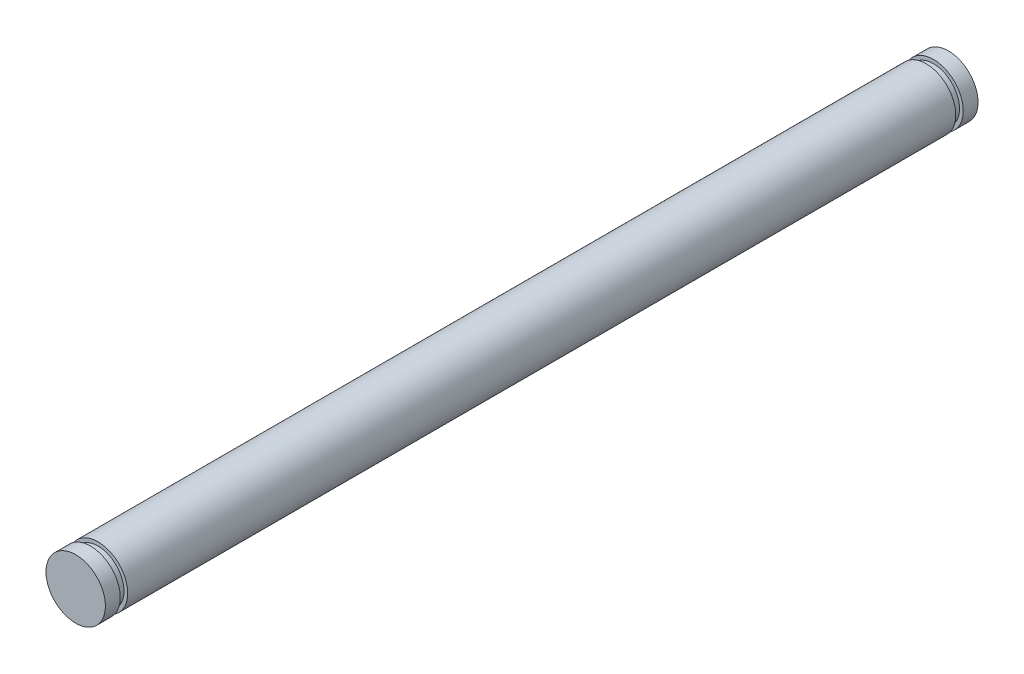
ISO-10303-21;
HEADER;
FILE_DESCRIPTION(('STEP AP214'),'2;1');
FILE_NAME('part.step','',(''),(''),'','','');
FILE_SCHEMA(('AUTOMOTIVE_DESIGN { 1 0 10303 214 1 1 1 1 }'));
ENDSEC;
DATA;
#1=APPLICATION_CONTEXT('core data for automotive mechanical design processes');
#2=APPLICATION_PROTOCOL_DEFINITION('international standard','automotive_design',2000,#1);
#3=PRODUCT_CONTEXT('',#1,'mechanical');
#4=PRODUCT('Part','Part','',(#3));
#5=PRODUCT_RELATED_PRODUCT_CATEGORY('part','',(#4));
#6=PRODUCT_DEFINITION_FORMATION('','',#4);
#7=PRODUCT_DEFINITION_CONTEXT('part definition',#1,'design');
#8=PRODUCT_DEFINITION('design','',#6,#7);
#9=PRODUCT_DEFINITION_SHAPE('','',#8);
#10=(LENGTH_UNIT() NAMED_UNIT(*) SI_UNIT(.MILLI.,.METRE.));
#11=(NAMED_UNIT(*) PLANE_ANGLE_UNIT() SI_UNIT($,.RADIAN.));
#12=(NAMED_UNIT(*) SI_UNIT($,.STERADIAN.) SOLID_ANGLE_UNIT());
#13=UNCERTAINTY_MEASURE_WITH_UNIT(LENGTH_MEASURE(1.E-05),#10,'distance_accuracy_value','');
#14=(GEOMETRIC_REPRESENTATION_CONTEXT(3) GLOBAL_UNCERTAINTY_ASSIGNED_CONTEXT((#13)) GLOBAL_UNIT_ASSIGNED_CONTEXT((#10,
#11,#12)) REPRESENTATION_CONTEXT('',''));
#15=CARTESIAN_POINT('',(0.,0.,0.));
#16=DIRECTION('',(0.,0.,1.));
#17=DIRECTION('',(1.,0.,0.));
#18=AXIS2_PLACEMENT_3D('',#15,#16,#17);
#19=CARTESIAN_POINT('',(0.,0.,117.5));
#20=DIRECTION('',(0.,0.,-1.));
#21=DIRECTION('',(-1.,0.,0.));
#22=AXIS2_PLACEMENT_3D('',#19,#20,#21);
#23=CYLINDRICAL_SURFACE('',#22,4.);
#24=CARTESIAN_POINT('',(0.,0.,2.));
#25=DIRECTION('',(0.,0.,1.));
#26=DIRECTION('',(1.,0.,0.));
#27=AXIS2_PLACEMENT_3D('',#24,#25,#26);
#28=CIRCLE('',#27,4.);
#29=CARTESIAN_POINT('',(-4.,0.,1.99999999999999));
#30=VERTEX_POINT('',#29);
#31=EDGE_CURVE('E43',#30,#30,#28,.T.);
#32=CARTESIAN_POINT('',(0.,0.,0.));
#33=DIRECTION('',(0.,0.,1.));
#34=DIRECTION('',(1.,0.,0.));
#35=AXIS2_PLACEMENT_3D('',#32,#33,#34);
#36=CIRCLE('',#35,4.);
#37=CARTESIAN_POINT('',(-4.,0.,0.));
#38=VERTEX_POINT('',#37);
#39=EDGE_CURVE('E36',#38,#38,#36,.T.);
#40=CARTESIAN_POINT('',(-4.,0.,1.99999999999999));
#41=CARTESIAN_POINT('',(-4.,0.,1.97916666666666));
#42=CARTESIAN_POINT('',(-4.,0.,1.95833333333333));
#43=CARTESIAN_POINT('',(-4.,0.,1.91666666666666));
#44=CARTESIAN_POINT('',(-4.,0.,1.89583333333332));
#45=CARTESIAN_POINT('',(-4.,0.,1.85416666666665));
#46=CARTESIAN_POINT('',(-4.,0.,1.83333333333332));
#47=CARTESIAN_POINT('',(-4.,0.,1.79166666666665));
#48=CARTESIAN_POINT('',(-4.,0.,1.77083333333332));
#49=CARTESIAN_POINT('',(-4.,0.,1.72916666666666));
#50=CARTESIAN_POINT('',(-4.,0.,1.70833333333333));
#51=CARTESIAN_POINT('',(-4.,0.,1.66666666666666));
#52=CARTESIAN_POINT('',(-4.,0.,1.64583333333332));
#53=CARTESIAN_POINT('',(-4.,0.,1.60416666666665));
#54=CARTESIAN_POINT('',(-4.,0.,1.58333333333332));
#55=CARTESIAN_POINT('',(-4.,0.,1.54166666666665));
#56=CARTESIAN_POINT('',(-4.,0.,1.52083333333332));
#57=CARTESIAN_POINT('',(-4.,0.,1.47916666666666));
#58=CARTESIAN_POINT('',(-4.,0.,1.45833333333333));
#59=CARTESIAN_POINT('',(-4.,0.,1.41666666666666));
#60=CARTESIAN_POINT('',(-4.,0.,1.39583333333332));
#61=CARTESIAN_POINT('',(-4.,0.,1.35416666666665));
#62=CARTESIAN_POINT('',(-4.,0.,1.33333333333332));
#63=CARTESIAN_POINT('',(-4.,0.,1.29166666666665));
#64=CARTESIAN_POINT('',(-4.,0.,1.27083333333332));
#65=CARTESIAN_POINT('',(-4.,0.,1.22916666666666));
#66=CARTESIAN_POINT('',(-4.,0.,1.20833333333333));
#67=CARTESIAN_POINT('',(-4.,0.,1.16666666666666));
#68=CARTESIAN_POINT('',(-4.,0.,1.14583333333332));
#69=CARTESIAN_POINT('',(-4.,0.,1.10416666666665));
#70=CARTESIAN_POINT('',(-4.,0.,1.08333333333332));
#71=CARTESIAN_POINT('',(-4.,0.,1.04166666666665));
#72=CARTESIAN_POINT('',(-4.,0.,1.02083333333332));
#73=CARTESIAN_POINT('',(-4.,0.,0.979166666666656));
#74=CARTESIAN_POINT('',(-4.,0.,0.958333333333325));
#75=CARTESIAN_POINT('',(-4.,0.,0.916666666666658));
#76=CARTESIAN_POINT('',(-4.,0.,0.895833333333323));
#77=CARTESIAN_POINT('',(-4.,0.,0.854166666666651));
#78=CARTESIAN_POINT('',(-4.,0.,0.833333333333316));
#79=CARTESIAN_POINT('',(-4.,0.,0.791666666666649));
#80=CARTESIAN_POINT('',(-4.,0.,0.770833333333318));
#81=CARTESIAN_POINT('',(-4.,0.,0.729166666666656));
#82=CARTESIAN_POINT('',(-4.,0.,0.708333333333325));
#83=CARTESIAN_POINT('',(-4.,0.,0.666666666666658));
#84=CARTESIAN_POINT('',(-4.,0.,0.645833333333322));
#85=CARTESIAN_POINT('',(-4.,0.,0.604166666666651));
#86=CARTESIAN_POINT('',(-4.,0.,0.583333333333315));
#87=CARTESIAN_POINT('',(-4.,0.,0.541666666666649));
#88=CARTESIAN_POINT('',(-4.,0.,0.520833333333318));
#89=CARTESIAN_POINT('',(-4.,0.,0.479166666666656));
#90=CARTESIAN_POINT('',(-4.,0.,0.458333333333324));
#91=CARTESIAN_POINT('',(-4.,0.,0.416666666666658));
#92=CARTESIAN_POINT('',(-4.,0.,0.395833333333322));
#93=CARTESIAN_POINT('',(-4.,0.,0.354166666666651));
#94=CARTESIAN_POINT('',(-4.,0.,0.333333333333315));
#95=CARTESIAN_POINT('',(-4.,0.,0.291666666666648));
#96=CARTESIAN_POINT('',(-4.,0.,0.270833333333317));
#97=CARTESIAN_POINT('',(-4.,0.,0.229166666666655));
#98=CARTESIAN_POINT('',(-4.,0.,0.208333333333324));
#99=CARTESIAN_POINT('',(-4.,0.,0.166666666666658));
#100=CARTESIAN_POINT('',(-4.,0.,0.145833333333322));
#101=CARTESIAN_POINT('',(-4.,0.,0.104166666666651));
#102=CARTESIAN_POINT('',(-4.,0.,0.0833333333333149));
#103=CARTESIAN_POINT('',(-4.,0.,0.0416666666666482));
#104=CARTESIAN_POINT('',(-4.,0.,0.0208333333333171));
#105=CARTESIAN_POINT('',(-4.,0.,0.));
#106=B_SPLINE_CURVE_WITH_KNOTS('',3,(#40,#41,#42,#43,#44,#45,#46,#47,#48,#49,#50,#51,#52,#53,
#54,#55,#56,#57,#58,#59,#60,#61,#62,#63,#64,#65,#66,#67,#68,#69,#70,#71,#72,#73,#74,#75,#76,#77,
#78,#79,#80,#81,#82,#83,#84,#85,#86,#87,#88,#89,#90,#91,#92,#93,#94,#95,#96,#97,#98,#99,#100,
#101,#102,#103,#104,#105),.UNSPECIFIED.,.F.,.F.,(4,2,2,2,2,2,2,2,2,2,2,2,2,2,2,2,2,2,2,2,2,2,2,
2,2,2,2,2,2,2,2,2,4),(0.,0.0624999999999931,0.125,0.187500000000007,0.25,0.312499999999993,
0.375,0.437500000000007,0.5,0.562499999999994,0.625000000000001,0.687500000000008,
0.750000000000001,0.812499999999994,0.875000000000001,0.937500000000008,1.,1.06249999999999,
1.125,1.18750000000001,1.25,1.31249999999999,1.375,1.43750000000001,1.5,1.56249999999999,1.625,
1.68750000000001,1.75,1.81249999999999,1.875,1.93750000000001,2.),.UNSPECIFIED.);
#107=EDGE_CURVE('BSEAM32',#30,#38,#106,.T.);
#108=ORIENTED_EDGE('',*,*,#31,.F.);
#109=ORIENTED_EDGE('',*,*,#39,.T.);
#110=ORIENTED_EDGE('',*,*,#107,.T.);
#111=ORIENTED_EDGE('',*,*,#107,.F.);
#112=EDGE_LOOP('',(#108,#110,#109,#111));
#113=FACE_BOUND('',#112,.T.);
#114=ADVANCED_FACE('F32',(#113),#23,.T.);
#115=CARTESIAN_POINT('',(0.,0.,0.));
#116=DIRECTION('',(0.,0.,1.));
#117=DIRECTION('',(1.,0.,0.));
#118=AXIS2_PLACEMENT_3D('',#115,#116,#117);
#119=PLANE('',#118);
#120=ORIENTED_EDGE('',*,*,#39,.F.);
#121=EDGE_LOOP('',(#120));
#122=FACE_BOUND('',#121,.T.);
#123=ADVANCED_FACE('F87',(#122),#119,.F.);
#124=CARTESIAN_POINT('',(4.,0.,2.));
#125=DIRECTION('',(0.,0.,-1.));
#126=DIRECTION('',(-1.,0.,0.));
#127=AXIS2_PLACEMENT_3D('',#124,#125,#126);
#128=PLANE('',#127);
#129=CARTESIAN_POINT('',(0.,0.,2.));
#130=DIRECTION('',(0.,0.,1.));
#131=DIRECTION('',(1.,0.,0.));
#132=AXIS2_PLACEMENT_3D('',#129,#130,#131);
#133=CIRCLE('',#132,3.5);
#134=CARTESIAN_POINT('',(3.5,0.,2.));
#135=VERTEX_POINT('',#134);
#136=EDGE_CURVE('E60',#135,#135,#133,.T.);
#137=ORIENTED_EDGE('',*,*,#136,.F.);
#138=EDGE_LOOP('',(#137));
#139=FACE_BOUND('',#138,.T.);
#140=ORIENTED_EDGE('',*,*,#31,.T.);
#141=EDGE_LOOP('',(#140));
#142=FACE_BOUND('',#141,.T.);
#143=ADVANCED_FACE('F81',(#139,#142),#128,.F.);
#144=CARTESIAN_POINT('',(0.,0.,117.5));
#145=DIRECTION('',(0.,0.,1.));
#146=DIRECTION('',(1.,0.,0.));
#147=AXIS2_PLACEMENT_3D('',#144,#145,#146);
#148=CYLINDRICAL_SURFACE('',#147,3.5);
#149=CARTESIAN_POINT('',(0.,0.,3.));
#150=DIRECTION('',(0.,0.,1.));
#151=DIRECTION('',(1.,0.,0.));
#152=AXIS2_PLACEMENT_3D('',#149,#150,#151);
#153=CIRCLE('',#152,3.5);
#154=CARTESIAN_POINT('',(3.5,0.,3.));
#155=VERTEX_POINT('',#154);
#156=EDGE_CURVE('E63',#155,#155,#153,.T.);
#157=ORIENTED_EDGE('',*,*,#156,.F.);
#158=EDGE_LOOP('',(#157));
#159=FACE_BOUND('',#158,.T.);
#160=ORIENTED_EDGE('',*,*,#136,.T.);
#161=EDGE_LOOP('',(#160));
#162=FACE_BOUND('',#161,.T.);
#163=ADVANCED_FACE('F75',(#159,#162),#148,.T.);
#164=CARTESIAN_POINT('',(3.5,0.,3.));
#165=DIRECTION('',(0.,0.,1.));
#166=DIRECTION('',(1.,0.,0.));
#167=AXIS2_PLACEMENT_3D('',#164,#165,#166);
#168=PLANE('',#167);
#169=CARTESIAN_POINT('',(0.,0.,3.));
#170=DIRECTION('',(0.,0.,1.));
#171=DIRECTION('',(1.,0.,0.));
#172=AXIS2_PLACEMENT_3D('',#169,#170,#171);
#173=CIRCLE('',#172,4.);
#174=CARTESIAN_POINT('',(-4.,0.,2.99999999999999));
#175=VERTEX_POINT('',#174);
#176=EDGE_CURVE('E48',#175,#175,#173,.T.);
#177=ORIENTED_EDGE('',*,*,#176,.F.);
#178=EDGE_LOOP('',(#177));
#179=FACE_BOUND('',#178,.T.);
#180=ORIENTED_EDGE('',*,*,#156,.T.);
#181=EDGE_LOOP('',(#180));
#182=FACE_BOUND('',#181,.T.);
#183=ADVANCED_FACE('F72',(#179,#182),#168,.F.);
#184=CARTESIAN_POINT('',(0.,0.,114.5));
#185=DIRECTION('',(0.,0.,1.));
#186=DIRECTION('',(1.,0.,0.));
#187=AXIS2_PLACEMENT_3D('',#184,#185,#186);
#188=CIRCLE('',#187,4.);
#189=CARTESIAN_POINT('',(-4.,0.,114.5));
#190=VERTEX_POINT('',#189);
#191=EDGE_CURVE('E55',#190,#190,#188,.T.);
#192=CARTESIAN_POINT('',(-4.,0.,2.99999999999999));
#193=CARTESIAN_POINT('',(-4.,0.,4.16145833333332));
#194=CARTESIAN_POINT('',(-4.,0.,5.32291666666665));
#195=CARTESIAN_POINT('',(-4.,0.,7.64583333333332));
#196=CARTESIAN_POINT('',(-4.,0.,8.80729166666665));
#197=CARTESIAN_POINT('',(-4.,0.,11.1302083333333));
#198=CARTESIAN_POINT('',(-4.,0.,12.2916666666667));
#199=CARTESIAN_POINT('',(-4.,0.,14.6145833333333));
#200=CARTESIAN_POINT('',(-4.,0.,15.7760416666667));
#201=CARTESIAN_POINT('',(-4.,0.,18.0989583333333));
#202=CARTESIAN_POINT('',(-4.,0.,19.2604166666667));
#203=CARTESIAN_POINT('',(-4.,0.,21.5833333333333));
#204=CARTESIAN_POINT('',(-4.,0.,22.7447916666667));
#205=CARTESIAN_POINT('',(-4.,0.,25.0677083333333));
#206=CARTESIAN_POINT('',(-4.,0.,26.2291666666667));
#207=CARTESIAN_POINT('',(-4.,0.,28.5520833333333));
#208=CARTESIAN_POINT('',(-4.,0.,29.7135416666667));
#209=CARTESIAN_POINT('',(-4.,0.,32.0364583333333));
#210=CARTESIAN_POINT('',(-4.,0.,33.1979166666667));
#211=CARTESIAN_POINT('',(-4.,0.,35.5208333333333));
#212=CARTESIAN_POINT('',(-4.,0.,36.6822916666667));
#213=CARTESIAN_POINT('',(-4.,0.,39.0052083333333));
#214=CARTESIAN_POINT('',(-4.,0.,40.1666666666667));
#215=CARTESIAN_POINT('',(-4.,0.,42.4895833333333));
#216=CARTESIAN_POINT('',(-4.,0.,43.6510416666667));
#217=CARTESIAN_POINT('',(-4.,0.,45.9739583333333));
#218=CARTESIAN_POINT('',(-4.,0.,47.1354166666667));
#219=CARTESIAN_POINT('',(-4.,0.,49.4583333333333));
#220=CARTESIAN_POINT('',(-4.,0.,50.6197916666667));
#221=CARTESIAN_POINT('',(-4.,0.,52.9427083333333));
#222=CARTESIAN_POINT('',(-4.,0.,54.1041666666667));
#223=CARTESIAN_POINT('',(-4.,0.,56.4270833333333));
#224=CARTESIAN_POINT('',(-4.,0.,57.5885416666667));
#225=CARTESIAN_POINT('',(-4.,0.,59.9114583333333));
#226=CARTESIAN_POINT('',(-4.,0.,61.0729166666667));
#227=CARTESIAN_POINT('',(-4.,0.,63.3958333333333));
#228=CARTESIAN_POINT('',(-4.,0.,64.5572916666667));
#229=CARTESIAN_POINT('',(-4.,0.,66.8802083333333));
#230=CARTESIAN_POINT('',(-4.,0.,68.0416666666667));
#231=CARTESIAN_POINT('',(-4.,0.,70.3645833333333));
#232=CARTESIAN_POINT('',(-4.,0.,71.5260416666667));
#233=CARTESIAN_POINT('',(-4.,0.,73.8489583333333));
#234=CARTESIAN_POINT('',(-4.,0.,75.0104166666666));
#235=CARTESIAN_POINT('',(-4.,0.,77.3333333333333));
#236=CARTESIAN_POINT('',(-4.,0.,78.4947916666666));
#237=CARTESIAN_POINT('',(-4.,0.,80.8177083333333));
#238=CARTESIAN_POINT('',(-4.,0.,81.9791666666667));
#239=CARTESIAN_POINT('',(-4.,0.,84.3020833333333));
#240=CARTESIAN_POINT('',(-4.,0.,85.4635416666667));
#241=CARTESIAN_POINT('',(-4.,0.,87.7864583333333));
#242=CARTESIAN_POINT('',(-4.,0.,88.9479166666666));
#243=CARTESIAN_POINT('',(-4.,0.,91.2708333333333));
#244=CARTESIAN_POINT('',(-4.,0.,92.4322916666666));
#245=CARTESIAN_POINT('',(-4.,0.,94.7552083333333));
#246=CARTESIAN_POINT('',(-4.,0.,95.9166666666666));
#247=CARTESIAN_POINT('',(-4.,0.,98.2395833333333));
#248=CARTESIAN_POINT('',(-4.,0.,99.4010416666666));
#249=CARTESIAN_POINT('',(-4.,0.,101.723958333333));
#250=CARTESIAN_POINT('',(-4.,0.,102.885416666667));
#251=CARTESIAN_POINT('',(-4.,0.,105.208333333333));
#252=CARTESIAN_POINT('',(-4.,0.,106.369791666667));
#253=CARTESIAN_POINT('',(-4.,0.,108.692708333333));
#254=CARTESIAN_POINT('',(-4.,0.,109.854166666667));
#255=CARTESIAN_POINT('',(-4.,0.,112.177083333333));
#256=CARTESIAN_POINT('',(-4.,0.,113.338541666667));
#257=CARTESIAN_POINT('',(-4.,0.,114.5));
#258=B_SPLINE_CURVE_WITH_KNOTS('',3,(#192,#193,#194,#195,#196,#197,#198,#199,#200,#201,#202,
#203,#204,#205,#206,#207,#208,#209,#210,#211,#212,#213,#214,#215,#216,#217,#218,#219,#220,#221,
#222,#223,#224,#225,#226,#227,#228,#229,#230,#231,#232,#233,#234,#235,#236,#237,#238,#239,#240,
#241,#242,#243,#244,#245,#246,#247,#248,#249,#250,#251,#252,#253,#254,#255,#256,#257),
.UNSPECIFIED.,.F.,.F.,(4,2,2,2,2,2,2,2,2,2,2,2,2,2,2,2,2,2,2,2,2,2,2,2,2,2,2,2,2,2,2,2,4),(0.,
3.484375,6.96875,10.453125,13.9375,17.421875,20.90625,24.390625,27.875,31.359375,34.84375,
38.328125,41.8125,45.296875,48.78125,52.265625,55.75,59.234375,62.71875,66.203125,69.6875,
73.171875,76.65625,80.140625,83.625,87.109375,90.59375,94.078125,97.5625,101.046875,104.53125,
108.015625,111.5),.UNSPECIFIED.);
#259=EDGE_CURVE('BSEAM69',#175,#190,#258,.T.);
#260=ORIENTED_EDGE('',*,*,#176,.T.);
#261=ORIENTED_EDGE('',*,*,#191,.F.);
#262=ORIENTED_EDGE('',*,*,#259,.T.);
#263=ORIENTED_EDGE('',*,*,#259,.F.);
#264=EDGE_LOOP('',(#260,#262,#261,#263));
#265=FACE_BOUND('',#264,.T.);
#266=ADVANCED_FACE('F69',(#265),#23,.T.);
#267=CARTESIAN_POINT('',(4.,0.,114.5));
#268=DIRECTION('',(0.,0.,-1.));
#269=DIRECTION('',(-1.,0.,0.));
#270=AXIS2_PLACEMENT_3D('',#267,#268,#269);
#271=PLANE('',#270);
#272=CARTESIAN_POINT('',(0.,0.,114.5));
#273=DIRECTION('',(0.,0.,1.));
#274=DIRECTION('',(1.,0.,0.));
#275=AXIS2_PLACEMENT_3D('',#272,#273,#274);
#276=CIRCLE('',#275,3.5);
#277=CARTESIAN_POINT('',(3.5,0.,114.5));
#278=VERTEX_POINT('',#277);
#279=EDGE_CURVE('E45',#278,#278,#276,.T.);
#280=ORIENTED_EDGE('',*,*,#279,.F.);
#281=EDGE_LOOP('',(#280));
#282=FACE_BOUND('',#281,.T.);
#283=ORIENTED_EDGE('',*,*,#191,.T.);
#284=EDGE_LOOP('',(#283));
#285=FACE_BOUND('',#284,.T.);
#286=ADVANCED_FACE('F103',(#282,#285),#271,.F.);
#287=CARTESIAN_POINT('',(0.,0.,117.5));
#288=DIRECTION('',(0.,0.,1.));
#289=DIRECTION('',(1.,0.,0.));
#290=AXIS2_PLACEMENT_3D('',#287,#288,#289);
#291=CYLINDRICAL_SURFACE('',#290,3.5);
#292=CARTESIAN_POINT('',(0.,0.,115.5));
#293=DIRECTION('',(0.,0.,1.));
#294=DIRECTION('',(1.,0.,0.));
#295=AXIS2_PLACEMENT_3D('',#292,#293,#294);
#296=CIRCLE('',#295,3.5);
#297=CARTESIAN_POINT('',(3.5,0.,115.5));
#298=VERTEX_POINT('',#297);
#299=EDGE_CURVE('E49',#298,#298,#296,.T.);
#300=ORIENTED_EDGE('',*,*,#299,.F.);
#301=EDGE_LOOP('',(#300));
#302=FACE_BOUND('',#301,.T.);
#303=ORIENTED_EDGE('',*,*,#279,.T.);
#304=EDGE_LOOP('',(#303));
#305=FACE_BOUND('',#304,.T.);
#306=ADVANCED_FACE('F106',(#302,#305),#291,.T.);
#307=CARTESIAN_POINT('',(3.5,0.,115.5));
#308=DIRECTION('',(0.,0.,1.));
#309=DIRECTION('',(1.,0.,0.));
#310=AXIS2_PLACEMENT_3D('',#307,#308,#309);
#311=PLANE('',#310);
#312=CARTESIAN_POINT('',(0.,0.,115.5));
#313=DIRECTION('',(0.,0.,1.));
#314=DIRECTION('',(1.,0.,0.));
#315=AXIS2_PLACEMENT_3D('',#312,#313,#314);
#316=CIRCLE('',#315,4.);
#317=CARTESIAN_POINT('',(-4.,0.,115.5));
#318=VERTEX_POINT('',#317);
#319=EDGE_CURVE('E52',#318,#318,#316,.T.);
#320=ORIENTED_EDGE('',*,*,#319,.F.);
#321=EDGE_LOOP('',(#320));
#322=FACE_BOUND('',#321,.T.);
#323=ORIENTED_EDGE('',*,*,#299,.T.);
#324=EDGE_LOOP('',(#323));
#325=FACE_BOUND('',#324,.T.);
#326=ADVANCED_FACE('F102',(#322,#325),#311,.F.);
#327=CARTESIAN_POINT('',(0.,0.,117.5));
#328=DIRECTION('',(0.,0.,1.));
#329=DIRECTION('',(1.,0.,0.));
#330=AXIS2_PLACEMENT_3D('',#327,#328,#329);
#331=PLANE('',#330);
#332=CARTESIAN_POINT('',(0.,0.,117.5));
#333=DIRECTION('',(0.,0.,1.));
#334=DIRECTION('',(1.,0.,0.));
#335=AXIS2_PLACEMENT_3D('',#332,#333,#334);
#336=CIRCLE('',#335,4.);
#337=CARTESIAN_POINT('',(-4.,0.,117.5));
#338=VERTEX_POINT('',#337);
#339=EDGE_CURVE('E10',#338,#338,#336,.T.);
#340=ORIENTED_EDGE('',*,*,#339,.T.);
#341=EDGE_LOOP('',(#340));
#342=FACE_BOUND('',#341,.T.);
#343=ADVANCED_FACE('F99',(#342),#331,.T.);
#344=CARTESIAN_POINT('',(-4.,0.,115.5));
#345=CARTESIAN_POINT('',(-4.,0.,115.520833333333));
#346=CARTESIAN_POINT('',(-4.,0.,115.541666666667));
#347=CARTESIAN_POINT('',(-4.,0.,115.583333333333));
#348=CARTESIAN_POINT('',(-4.,0.,115.604166666667));
#349=CARTESIAN_POINT('',(-4.,0.,115.645833333333));
#350=CARTESIAN_POINT('',(-4.,0.,115.666666666667));
#351=CARTESIAN_POINT('',(-4.,0.,115.708333333333));
#352=CARTESIAN_POINT('',(-4.,0.,115.729166666667));
#353=CARTESIAN_POINT('',(-4.,0.,115.770833333333));
#354=CARTESIAN_POINT('',(-4.,0.,115.791666666667));
#355=CARTESIAN_POINT('',(-4.,0.,115.833333333333));
#356=CARTESIAN_POINT('',(-4.,0.,115.854166666667));
#357=CARTESIAN_POINT('',(-4.,0.,115.895833333333));
#358=CARTESIAN_POINT('',(-4.,0.,115.916666666667));
#359=CARTESIAN_POINT('',(-4.,0.,115.958333333333));
#360=CARTESIAN_POINT('',(-4.,0.,115.979166666667));
#361=CARTESIAN_POINT('',(-4.,0.,116.020833333333));
#362=CARTESIAN_POINT('',(-4.,0.,116.041666666667));
#363=CARTESIAN_POINT('',(-4.,0.,116.083333333333));
#364=CARTESIAN_POINT('',(-4.,0.,116.104166666667));
#365=CARTESIAN_POINT('',(-4.,0.,116.145833333333));
#366=CARTESIAN_POINT('',(-4.,0.,116.166666666667));
#367=CARTESIAN_POINT('',(-4.,0.,116.208333333333));
#368=CARTESIAN_POINT('',(-4.,0.,116.229166666667));
#369=CARTESIAN_POINT('',(-4.,0.,116.270833333333));
#370=CARTESIAN_POINT('',(-4.,0.,116.291666666667));
#371=CARTESIAN_POINT('',(-4.,0.,116.333333333333));
#372=CARTESIAN_POINT('',(-4.,0.,116.354166666667));
#373=CARTESIAN_POINT('',(-4.,0.,116.395833333333));
#374=CARTESIAN_POINT('',(-4.,0.,116.416666666667));
#375=CARTESIAN_POINT('',(-4.,0.,116.458333333333));
#376=CARTESIAN_POINT('',(-4.,0.,116.479166666667));
#377=CARTESIAN_POINT('',(-4.,0.,116.520833333333));
#378=CARTESIAN_POINT('',(-4.,0.,116.541666666667));
#379=CARTESIAN_POINT('',(-4.,0.,116.583333333333));
#380=CARTESIAN_POINT('',(-4.,0.,116.604166666667));
#381=CARTESIAN_POINT('',(-4.,0.,116.645833333333));
#382=CARTESIAN_POINT('',(-4.,0.,116.666666666667));
#383=CARTESIAN_POINT('',(-4.,0.,116.708333333333));
#384=CARTESIAN_POINT('',(-4.,0.,116.729166666667));
#385=CARTESIAN_POINT('',(-4.,0.,116.770833333333));
#386=CARTESIAN_POINT('',(-4.,0.,116.791666666667));
#387=CARTESIAN_POINT('',(-4.,0.,116.833333333333));
#388=CARTESIAN_POINT('',(-4.,0.,116.854166666667));
#389=CARTESIAN_POINT('',(-4.,0.,116.895833333333));
#390=CARTESIAN_POINT('',(-4.,0.,116.916666666667));
#391=CARTESIAN_POINT('',(-4.,0.,116.958333333333));
#392=CARTESIAN_POINT('',(-4.,0.,116.979166666667));
#393=CARTESIAN_POINT('',(-4.,0.,117.020833333333));
#394=CARTESIAN_POINT('',(-4.,0.,117.041666666667));
#395=CARTESIAN_POINT('',(-4.,0.,117.083333333333));
#396=CARTESIAN_POINT('',(-4.,0.,117.104166666667));
#397=CARTESIAN_POINT('',(-4.,0.,117.145833333333));
#398=CARTESIAN_POINT('',(-4.,0.,117.166666666667));
#399=CARTESIAN_POINT('',(-4.,0.,117.208333333333));
#400=CARTESIAN_POINT('',(-4.,0.,117.229166666667));
#401=CARTESIAN_POINT('',(-4.,0.,117.270833333333));
#402=CARTESIAN_POINT('',(-4.,0.,117.291666666667));
#403=CARTESIAN_POINT('',(-4.,0.,117.333333333333));
#404=CARTESIAN_POINT('',(-4.,0.,117.354166666667));
#405=CARTESIAN_POINT('',(-4.,0.,117.395833333333));
#406=CARTESIAN_POINT('',(-4.,0.,117.416666666667));
#407=CARTESIAN_POINT('',(-4.,0.,117.458333333333));
#408=CARTESIAN_POINT('',(-4.,0.,117.479166666667));
#409=CARTESIAN_POINT('',(-4.,0.,117.5));
#410=B_SPLINE_CURVE_WITH_KNOTS('',3,(#344,#345,#346,#347,#348,#349,#350,#351,#352,#353,#354,
#355,#356,#357,#358,#359,#360,#361,#362,#363,#364,#365,#366,#367,#368,#369,#370,#371,#372,#373,
#374,#375,#376,#377,#378,#379,#380,#381,#382,#383,#384,#385,#386,#387,#388,#389,#390,#391,#392,
#393,#394,#395,#396,#397,#398,#399,#400,#401,#402,#403,#404,#405,#406,#407,#408,#409),
.UNSPECIFIED.,.F.,.F.,(4,2,2,2,2,2,2,2,2,2,2,2,2,2,2,2,2,2,2,2,2,2,2,2,2,2,2,2,2,2,2,2,4),(0.,
0.062500000000007,0.125,0.187500000000007,0.25,0.312500000000007,0.375,0.437500000000007,0.5,
0.562500000000007,0.625000000000001,0.687500000000008,0.750000000000001,0.812500000000008,
0.875000000000001,0.937500000000008,1.,1.06250000000001,1.125,1.18750000000001,1.25,
1.31250000000001,1.375,1.43750000000001,1.5,1.56250000000001,1.625,1.68750000000001,
1.75000000000002,1.81250000000001,1.87500000000002,1.93750000000001,2.00000000000002),.UNSPECIFIED.);
#411=EDGE_CURVE('BSEAM34',#318,#338,#410,.T.);
#412=ORIENTED_EDGE('',*,*,#319,.T.);
#413=ORIENTED_EDGE('',*,*,#339,.F.);
#414=ORIENTED_EDGE('',*,*,#411,.T.);
#415=ORIENTED_EDGE('',*,*,#411,.F.);
#416=EDGE_LOOP('',(#412,#414,#413,#415));
#417=FACE_BOUND('',#416,.T.);
#418=ADVANCED_FACE('F34',(#417),#23,.T.);
#419=CLOSED_SHELL('',(#114,#123,#143,#163,#183,#266,#286,#306,#326,#343,#418));
#420=MANIFOLD_SOLID_BREP('B2',#419);
#421=ADVANCED_BREP_SHAPE_REPRESENTATION('',(#18,#420),#14);
#422=SHAPE_DEFINITION_REPRESENTATION(#9,#421);
ENDSEC;
END-ISO-10303-21;
